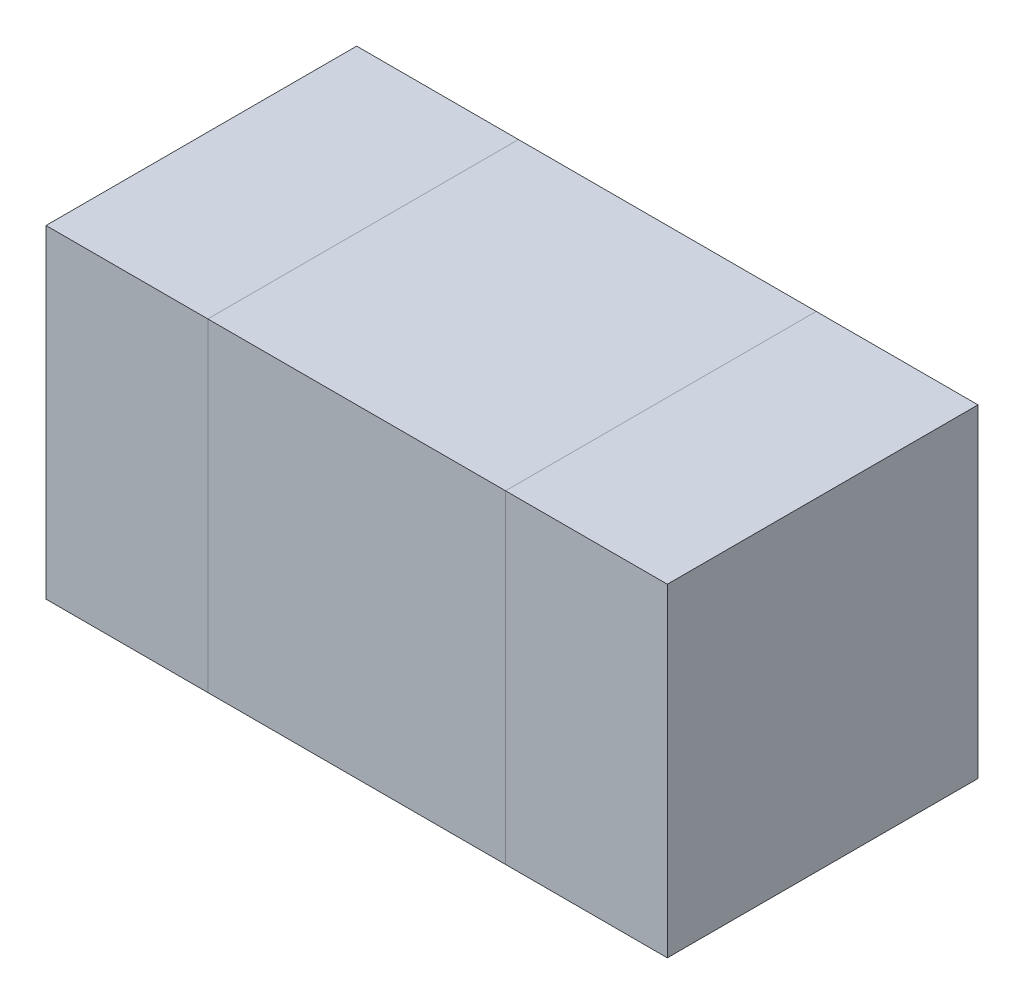
ISO-10303-21;
HEADER;
FILE_DESCRIPTION(('STEP AP214'),'2;1');
FILE_NAME('part.step','',(''),(''),'','','');
FILE_SCHEMA(('AUTOMOTIVE_DESIGN { 1 0 10303 214 1 1 1 1 }'));
ENDSEC;
DATA;
#1=APPLICATION_CONTEXT('core data for automotive mechanical design processes');
#2=APPLICATION_PROTOCOL_DEFINITION('international standard','automotive_design',2000,#1);
#3=PRODUCT_CONTEXT('',#1,'mechanical');
#4=PRODUCT('Part','Part','',(#3));
#5=PRODUCT_RELATED_PRODUCT_CATEGORY('part','',(#4));
#6=PRODUCT_DEFINITION_FORMATION('','',#4);
#7=PRODUCT_DEFINITION_CONTEXT('part definition',#1,'design');
#8=PRODUCT_DEFINITION('design','',#6,#7);
#9=PRODUCT_DEFINITION_SHAPE('','',#8);
#10=(LENGTH_UNIT() NAMED_UNIT(*) SI_UNIT(.MILLI.,.METRE.));
#11=(NAMED_UNIT(*) PLANE_ANGLE_UNIT() SI_UNIT($,.RADIAN.));
#12=(NAMED_UNIT(*) SI_UNIT($,.STERADIAN.) SOLID_ANGLE_UNIT());
#13=UNCERTAINTY_MEASURE_WITH_UNIT(LENGTH_MEASURE(1.E-05),#10,'distance_accuracy_value','');
#14=(GEOMETRIC_REPRESENTATION_CONTEXT(3) GLOBAL_UNCERTAINTY_ASSIGNED_CONTEXT((#13)) GLOBAL_UNIT_ASSIGNED_CONTEXT((#10,
#11,#12)) REPRESENTATION_CONTEXT('',''));
#15=CARTESIAN_POINT('',(0.,0.,0.));
#16=DIRECTION('',(0.,0.,1.));
#17=DIRECTION('',(1.,0.,0.));
#18=AXIS2_PLACEMENT_3D('',#15,#16,#17);
#19=CARTESIAN_POINT('',(0.23,0.,0.));
#20=DIRECTION('',(1.,0.,0.));
#21=DIRECTION('',(0.,1.,0.));
#22=AXIS2_PLACEMENT_3D('',#19,#20,#21);
#23=PLANE('',#22);
#24=DIRECTION('',(0.,-1.,0.));
#25=VECTOR('',#24,1.);
#26=CARTESIAN_POINT('',(0.23,0.25,0.48));
#27=LINE('',#26,#25);
#28=CARTESIAN_POINT('',(0.23,0.25,0.48));
#29=VERTEX_POINT('',#28);
#30=CARTESIAN_POINT('',(0.23,-0.25,0.48));
#31=VERTEX_POINT('',#30);
#32=EDGE_CURVE('P0_E94',#29,#31,#27,.T.);
#33=ORIENTED_EDGE('',*,*,#32,.T.);
#34=DIRECTION('',(0.,0.,-1.));
#35=VECTOR('',#34,1.);
#36=CARTESIAN_POINT('',(0.23,-0.25,0.48));
#37=LINE('',#36,#35);
#38=CARTESIAN_POINT('',(0.23,-0.25,0.));
#39=VERTEX_POINT('',#38);
#40=EDGE_CURVE('P0_E28',#31,#39,#37,.T.);
#41=ORIENTED_EDGE('',*,*,#40,.T.);
#42=DIRECTION('',(0.,1.,0.));
#43=VECTOR('',#42,1.);
#44=CARTESIAN_POINT('',(0.23,-0.25,0.));
#45=LINE('',#44,#43);
#46=CARTESIAN_POINT('',(0.23,0.25,0.));
#47=VERTEX_POINT('',#46);
#48=EDGE_CURVE('P0_E86',#39,#47,#45,.T.);
#49=ORIENTED_EDGE('',*,*,#48,.T.);
#50=DIRECTION('',(0.,0.,1.));
#51=VECTOR('',#50,1.);
#52=CARTESIAN_POINT('',(0.23,0.25,0.));
#53=LINE('',#52,#51);
#54=EDGE_CURVE('P0_E11',#47,#29,#53,.T.);
#55=ORIENTED_EDGE('',*,*,#54,.T.);
#56=EDGE_LOOP('',(#33,#41,#49,#55));
#57=FACE_BOUND('',#56,.T.);
#58=ADVANCED_FACE('P0_F17',(#57),#23,.T.);
#59=CARTESIAN_POINT('',(0.23,0.25,0.));
#60=DIRECTION('',(0.,-1.,0.));
#61=DIRECTION('',(0.,0.,-1.));
#62=AXIS2_PLACEMENT_3D('',#59,#60,#61);
#63=PLANE('',#62);
#64=DIRECTION('',(1.,0.,0.));
#65=VECTOR('',#64,1.);
#66=CARTESIAN_POINT('',(0.23,0.25,0.48));
#67=LINE('',#66,#65);
#68=CARTESIAN_POINT('',(-0.23,0.25,0.48));
#69=VERTEX_POINT('',#68);
#70=EDGE_CURVE('P0_E84',#69,#29,#67,.T.);
#71=ORIENTED_EDGE('',*,*,#70,.T.);
#72=ORIENTED_EDGE('',*,*,#54,.F.);
#73=DIRECTION('',(1.,0.,0.));
#74=VECTOR('',#73,1.);
#75=CARTESIAN_POINT('',(0.23,0.25,0.));
#76=LINE('',#75,#74);
#77=CARTESIAN_POINT('',(-0.23,0.25,0.));
#78=VERTEX_POINT('',#77);
#79=EDGE_CURVE('P0_E82',#78,#47,#76,.T.);
#80=ORIENTED_EDGE('',*,*,#79,.F.);
#81=DIRECTION('',(0.,0.,1.));
#82=VECTOR('',#81,1.);
#83=CARTESIAN_POINT('',(-0.23,0.25,0.));
#84=LINE('',#83,#82);
#85=EDGE_CURVE('P0_E56',#78,#69,#84,.T.);
#86=ORIENTED_EDGE('',*,*,#85,.T.);
#87=EDGE_LOOP('',(#71,#72,#80,#86));
#88=FACE_BOUND('',#87,.T.);
#89=ADVANCED_FACE('P0_F80',(#88),#63,.F.);
#90=CARTESIAN_POINT('',(0.23,-0.25,0.48));
#91=DIRECTION('',(0.,1.,0.));
#92=DIRECTION('',(1.,0.,0.));
#93=AXIS2_PLACEMENT_3D('',#90,#91,#92);
#94=PLANE('',#93);
#95=DIRECTION('',(1.,0.,0.));
#96=VECTOR('',#95,1.);
#97=CARTESIAN_POINT('',(0.23,-0.25,0.));
#98=LINE('',#97,#96);
#99=CARTESIAN_POINT('',(-0.23,-0.25,0.));
#100=VERTEX_POINT('',#99);
#101=EDGE_CURVE('P0_E90',#100,#39,#98,.T.);
#102=ORIENTED_EDGE('',*,*,#101,.T.);
#103=ORIENTED_EDGE('',*,*,#40,.F.);
#104=DIRECTION('',(1.,0.,0.));
#105=VECTOR('',#104,1.);
#106=CARTESIAN_POINT('',(0.23,-0.25,0.48));
#107=LINE('',#106,#105);
#108=CARTESIAN_POINT('',(-0.23,-0.25,0.48));
#109=VERTEX_POINT('',#108);
#110=EDGE_CURVE('P0_E100',#109,#31,#107,.T.);
#111=ORIENTED_EDGE('',*,*,#110,.F.);
#112=DIRECTION('',(0.,0.,-1.));
#113=VECTOR('',#112,1.);
#114=CARTESIAN_POINT('',(-0.23,-0.25,0.48));
#115=LINE('',#114,#113);
#116=EDGE_CURVE('P0_E41',#109,#100,#115,.T.);
#117=ORIENTED_EDGE('',*,*,#116,.T.);
#118=EDGE_LOOP('',(#102,#103,#111,#117));
#119=FACE_BOUND('',#118,.T.);
#120=ADVANCED_FACE('P0_F171',(#119),#94,.F.);
#121=CARTESIAN_POINT('',(-0.23,0.,0.));
#122=DIRECTION('',(1.,0.,0.));
#123=DIRECTION('',(0.,1.,0.));
#124=AXIS2_PLACEMENT_3D('',#121,#122,#123);
#125=PLANE('',#124);
#126=DIRECTION('',(0.,-1.,0.));
#127=VECTOR('',#126,1.);
#128=CARTESIAN_POINT('',(-0.23,0.25,0.48));
#129=LINE('',#128,#127);
#130=EDGE_CURVE('P0_E111',#69,#109,#129,.T.);
#131=ORIENTED_EDGE('',*,*,#130,.F.);
#132=ORIENTED_EDGE('',*,*,#85,.F.);
#133=DIRECTION('',(0.,1.,0.));
#134=VECTOR('',#133,1.);
#135=CARTESIAN_POINT('',(-0.23,-0.25,0.));
#136=LINE('',#135,#134);
#137=EDGE_CURVE('P0_E21',#100,#78,#136,.T.);
#138=ORIENTED_EDGE('',*,*,#137,.F.);
#139=ORIENTED_EDGE('',*,*,#116,.F.);
#140=EDGE_LOOP('',(#131,#132,#138,#139));
#141=FACE_BOUND('',#140,.T.);
#142=ADVANCED_FACE('P0_F19',(#141),#125,.F.);
#143=CARTESIAN_POINT('',(0.23,-0.25,0.));
#144=DIRECTION('',(0.,0.,1.));
#145=DIRECTION('',(1.,0.,0.));
#146=AXIS2_PLACEMENT_3D('',#143,#144,#145);
#147=PLANE('',#146);
#148=ORIENTED_EDGE('',*,*,#79,.T.);
#149=ORIENTED_EDGE('',*,*,#48,.F.);
#150=ORIENTED_EDGE('',*,*,#101,.F.);
#151=ORIENTED_EDGE('',*,*,#137,.T.);
#152=EDGE_LOOP('',(#148,#149,#150,#151));
#153=FACE_BOUND('',#152,.T.);
#154=ADVANCED_FACE('P0_F92',(#153),#147,.F.);
#155=CARTESIAN_POINT('',(0.23,0.25,0.48));
#156=DIRECTION('',(0.,0.,-1.));
#157=DIRECTION('',(0.,-1.,0.));
#158=AXIS2_PLACEMENT_3D('',#155,#156,#157);
#159=PLANE('',#158);
#160=ORIENTED_EDGE('',*,*,#70,.F.);
#161=ORIENTED_EDGE('',*,*,#130,.T.);
#162=ORIENTED_EDGE('',*,*,#110,.T.);
#163=ORIENTED_EDGE('',*,*,#32,.F.);
#164=EDGE_LOOP('',(#160,#161,#162,#163));
#165=FACE_BOUND('',#164,.T.);
#166=ADVANCED_FACE('P0_F158',(#165),#159,.F.);
#167=CLOSED_SHELL('',(#58,#89,#120,#142,#154,#166));
#168=MANIFOLD_SOLID_BREP('P0_B1',#167);
#169=CARTESIAN_POINT('',(-0.23,0.,0.));
#170=DIRECTION('',(1.,0.,0.));
#171=DIRECTION('',(0.,1.,0.));
#172=AXIS2_PLACEMENT_3D('',#169,#170,#171);
#173=PLANE('',#172);
#174=DIRECTION('',(0.,0.,1.));
#175=VECTOR('',#174,1.);
#176=CARTESIAN_POINT('',(-0.23,0.25,0.));
#177=LINE('',#176,#175);
#178=CARTESIAN_POINT('',(-0.23,0.25,0.));
#179=VERTEX_POINT('',#178);
#180=CARTESIAN_POINT('',(-0.23,0.25,0.48));
#181=VERTEX_POINT('',#180);
#182=EDGE_CURVE('P1_E89',#179,#181,#177,.T.);
#183=ORIENTED_EDGE('',*,*,#182,.T.);
#184=DIRECTION('',(0.,-1.,0.));
#185=VECTOR('',#184,1.);
#186=CARTESIAN_POINT('',(-0.23,0.25,0.48));
#187=LINE('',#186,#185);
#188=CARTESIAN_POINT('',(-0.23,-0.25,0.48));
#189=VERTEX_POINT('',#188);
#190=EDGE_CURVE('P1_E102',#181,#189,#187,.T.);
#191=ORIENTED_EDGE('',*,*,#190,.T.);
#192=DIRECTION('',(0.,0.,-1.));
#193=VECTOR('',#192,1.);
#194=CARTESIAN_POINT('',(-0.23,-0.25,0.48));
#195=LINE('',#194,#193);
#196=CARTESIAN_POINT('',(-0.23,-0.25,0.));
#197=VERTEX_POINT('',#196);
#198=EDGE_CURVE('P1_E27',#189,#197,#195,.T.);
#199=ORIENTED_EDGE('',*,*,#198,.T.);
#200=DIRECTION('',(0.,1.,0.));
#201=VECTOR('',#200,1.);
#202=CARTESIAN_POINT('',(-0.23,-0.25,0.));
#203=LINE('',#202,#201);
#204=EDGE_CURVE('P1_E98',#197,#179,#203,.T.);
#205=ORIENTED_EDGE('',*,*,#204,.T.);
#206=EDGE_LOOP('',(#183,#191,#199,#205));
#207=FACE_BOUND('',#206,.T.);
#208=ADVANCED_FACE('P1_F17',(#207),#173,.T.);
#209=CARTESIAN_POINT('',(-0.48,0.,0.));
#210=DIRECTION('',(1.,0.,0.));
#211=DIRECTION('',(0.,1.,0.));
#212=AXIS2_PLACEMENT_3D('',#209,#210,#211);
#213=PLANE('',#212);
#214=DIRECTION('',(0.,0.,-1.));
#215=VECTOR('',#214,1.);
#216=CARTESIAN_POINT('',(-0.48,0.25,0.));
#217=LINE('',#216,#215);
#218=CARTESIAN_POINT('',(-0.48,0.25,0.48));
#219=VERTEX_POINT('',#218);
#220=CARTESIAN_POINT('',(-0.48,0.25,0.));
#221=VERTEX_POINT('',#220);
#222=EDGE_CURVE('P1_E77',#219,#221,#217,.T.);
#223=ORIENTED_EDGE('',*,*,#222,.T.);
#224=DIRECTION('',(0.,-1.,0.));
#225=VECTOR('',#224,1.);
#226=CARTESIAN_POINT('',(-0.48,-0.125,0.));
#227=LINE('',#226,#225);
#228=CARTESIAN_POINT('',(-0.48,-0.25,0.));
#229=VERTEX_POINT('',#228);
#230=EDGE_CURVE('P1_E66',#221,#229,#227,.T.);
#231=ORIENTED_EDGE('',*,*,#230,.T.);
#232=DIRECTION('',(0.,0.,-1.));
#233=VECTOR('',#232,1.);
#234=CARTESIAN_POINT('',(-0.48,-0.25,0.24));
#235=LINE('',#234,#233);
#236=CARTESIAN_POINT('',(-0.48,-0.25,0.48));
#237=VERTEX_POINT('',#236);
#238=EDGE_CURVE('P1_E11',#237,#229,#235,.T.);
#239=ORIENTED_EDGE('',*,*,#238,.F.);
#240=DIRECTION('',(0.,-1.,0.));
#241=VECTOR('',#240,1.);
#242=CARTESIAN_POINT('',(-0.48,0.125,0.48));
#243=LINE('',#242,#241);
#244=EDGE_CURVE('P1_E75',#219,#237,#243,.T.);
#245=ORIENTED_EDGE('',*,*,#244,.F.);
#246=EDGE_LOOP('',(#223,#231,#239,#245));
#247=FACE_BOUND('',#246,.T.);
#248=ADVANCED_FACE('P1_F78',(#247),#213,.F.);
#249=CARTESIAN_POINT('',(-0.48,-0.25,0.48));
#250=DIRECTION('',(0.,-1.,0.));
#251=DIRECTION('',(0.,0.,-1.));
#252=AXIS2_PLACEMENT_3D('',#249,#250,#251);
#253=PLANE('',#252);
#254=DIRECTION('',(1.,0.,0.));
#255=VECTOR('',#254,1.);
#256=CARTESIAN_POINT('',(-0.48,-0.25,0.));
#257=LINE('',#256,#255);
#258=EDGE_CURVE('P1_E72',#229,#197,#257,.T.);
#259=ORIENTED_EDGE('',*,*,#258,.T.);
#260=ORIENTED_EDGE('',*,*,#198,.F.);
#261=DIRECTION('',(-1.,0.,0.));
#262=VECTOR('',#261,1.);
#263=CARTESIAN_POINT('',(-0.48,-0.25,0.48));
#264=LINE('',#263,#262);
#265=EDGE_CURVE('P1_E101',#189,#237,#264,.T.);
#266=ORIENTED_EDGE('',*,*,#265,.T.);
#267=ORIENTED_EDGE('',*,*,#238,.T.);
#268=EDGE_LOOP('',(#259,#260,#266,#267));
#269=FACE_BOUND('',#268,.T.);
#270=ADVANCED_FACE('P1_F119',(#269),#253,.T.);
#271=CARTESIAN_POINT('',(-0.48,0.25,0.48));
#272=DIRECTION('',(0.,0.,1.));
#273=DIRECTION('',(1.,0.,0.));
#274=AXIS2_PLACEMENT_3D('',#271,#272,#273);
#275=PLANE('',#274);
#276=DIRECTION('',(-1.,0.,0.));
#277=VECTOR('',#276,1.);
#278=CARTESIAN_POINT('',(-0.48,0.25,0.48));
#279=LINE('',#278,#277);
#280=EDGE_CURVE('P1_E84',#181,#219,#279,.T.);
#281=ORIENTED_EDGE('',*,*,#280,.T.);
#282=ORIENTED_EDGE('',*,*,#244,.T.);
#283=ORIENTED_EDGE('',*,*,#265,.F.);
#284=ORIENTED_EDGE('',*,*,#190,.F.);
#285=EDGE_LOOP('',(#281,#282,#283,#284));
#286=FACE_BOUND('',#285,.T.);
#287=ADVANCED_FACE('P1_F19',(#286),#275,.T.);
#288=CARTESIAN_POINT('',(-0.48,-0.25,0.));
#289=DIRECTION('',(0.,0.,-1.));
#290=DIRECTION('',(0.,-1.,0.));
#291=AXIS2_PLACEMENT_3D('',#288,#289,#290);
#292=PLANE('',#291);
#293=DIRECTION('',(1.,0.,0.));
#294=VECTOR('',#293,1.);
#295=CARTESIAN_POINT('',(-0.48,0.25,0.));
#296=LINE('',#295,#294);
#297=EDGE_CURVE('P1_E71',#221,#179,#296,.T.);
#298=ORIENTED_EDGE('',*,*,#297,.T.);
#299=ORIENTED_EDGE('',*,*,#204,.F.);
#300=ORIENTED_EDGE('',*,*,#258,.F.);
#301=ORIENTED_EDGE('',*,*,#230,.F.);
#302=EDGE_LOOP('',(#298,#299,#300,#301));
#303=FACE_BOUND('',#302,.T.);
#304=ADVANCED_FACE('P1_F68',(#303),#292,.T.);
#305=CARTESIAN_POINT('',(-0.48,0.25,0.));
#306=DIRECTION('',(0.,1.,0.));
#307=DIRECTION('',(1.,0.,0.));
#308=AXIS2_PLACEMENT_3D('',#305,#306,#307);
#309=PLANE('',#308);
#310=ORIENTED_EDGE('',*,*,#297,.F.);
#311=ORIENTED_EDGE('',*,*,#222,.F.);
#312=ORIENTED_EDGE('',*,*,#280,.F.);
#313=ORIENTED_EDGE('',*,*,#182,.F.);
#314=EDGE_LOOP('',(#310,#311,#312,#313));
#315=FACE_BOUND('',#314,.T.);
#316=ADVANCED_FACE('P1_F87',(#315),#309,.T.);
#317=CLOSED_SHELL('',(#208,#248,#270,#287,#304,#316));
#318=MANIFOLD_SOLID_BREP('P1_B1',#317);
#319=CARTESIAN_POINT('',(0.23,0.,0.));
#320=DIRECTION('',(1.,0.,0.));
#321=DIRECTION('',(0.,1.,0.));
#322=AXIS2_PLACEMENT_3D('',#319,#320,#321);
#323=PLANE('',#322);
#324=DIRECTION('',(0.,0.,1.));
#325=VECTOR('',#324,1.);
#326=CARTESIAN_POINT('',(0.23,0.25,0.));
#327=LINE('',#326,#325);
#328=CARTESIAN_POINT('',(0.23,0.25,0.));
#329=VERTEX_POINT('',#328);
#330=CARTESIAN_POINT('',(0.23,0.25,0.48));
#331=VERTEX_POINT('',#330);
#332=EDGE_CURVE('P2_E69',#329,#331,#327,.T.);
#333=ORIENTED_EDGE('',*,*,#332,.F.);
#334=DIRECTION('',(0.,1.,0.));
#335=VECTOR('',#334,1.);
#336=CARTESIAN_POINT('',(0.23,-0.25,0.));
#337=LINE('',#336,#335);
#338=CARTESIAN_POINT('',(0.23,-0.25,0.));
#339=VERTEX_POINT('',#338);
#340=EDGE_CURVE('P2_E21',#339,#329,#337,.T.);
#341=ORIENTED_EDGE('',*,*,#340,.F.);
#342=DIRECTION('',(0.,0.,-1.));
#343=VECTOR('',#342,1.);
#344=CARTESIAN_POINT('',(0.23,-0.25,0.48));
#345=LINE('',#344,#343);
#346=CARTESIAN_POINT('',(0.23,-0.25,0.48));
#347=VERTEX_POINT('',#346);
#348=EDGE_CURVE('P2_E11',#347,#339,#345,.T.);
#349=ORIENTED_EDGE('',*,*,#348,.F.);
#350=DIRECTION('',(0.,-1.,0.));
#351=VECTOR('',#350,1.);
#352=CARTESIAN_POINT('',(0.23,0.25,0.48));
#353=LINE('',#352,#351);
#354=EDGE_CURVE('P2_E65',#331,#347,#353,.T.);
#355=ORIENTED_EDGE('',*,*,#354,.F.);
#356=EDGE_LOOP('',(#333,#341,#349,#355));
#357=FACE_BOUND('',#356,.T.);
#358=ADVANCED_FACE('P2_F17',(#357),#323,.F.);
#359=CARTESIAN_POINT('',(0.48,0.,0.));
#360=DIRECTION('',(1.,0.,0.));
#361=DIRECTION('',(0.,1.,0.));
#362=AXIS2_PLACEMENT_3D('',#359,#360,#361);
#363=PLANE('',#362);
#364=DIRECTION('',(0.,0.,-1.));
#365=VECTOR('',#364,1.);
#366=CARTESIAN_POINT('',(0.48,0.25,0.));
#367=LINE('',#366,#365);
#368=CARTESIAN_POINT('',(0.48,0.25,0.48));
#369=VERTEX_POINT('',#368);
#370=CARTESIAN_POINT('',(0.48,0.25,0.));
#371=VERTEX_POINT('',#370);
#372=EDGE_CURVE('P2_E83',#369,#371,#367,.T.);
#373=ORIENTED_EDGE('',*,*,#372,.F.);
#374=DIRECTION('',(0.,-1.,0.));
#375=VECTOR('',#374,1.);
#376=CARTESIAN_POINT('',(0.48,0.125,0.48));
#377=LINE('',#376,#375);
#378=CARTESIAN_POINT('',(0.48,-0.25,0.48));
#379=VERTEX_POINT('',#378);
#380=EDGE_CURVE('P2_E78',#369,#379,#377,.T.);
#381=ORIENTED_EDGE('',*,*,#380,.T.);
#382=DIRECTION('',(0.,0.,-1.));
#383=VECTOR('',#382,1.);
#384=CARTESIAN_POINT('',(0.48,-0.25,0.24));
#385=LINE('',#384,#383);
#386=CARTESIAN_POINT('',(0.48,-0.25,0.));
#387=VERTEX_POINT('',#386);
#388=EDGE_CURVE('P2_E28',#379,#387,#385,.T.);
#389=ORIENTED_EDGE('',*,*,#388,.T.);
#390=DIRECTION('',(0.,-1.,0.));
#391=VECTOR('',#390,1.);
#392=CARTESIAN_POINT('',(0.48,-0.125,0.));
#393=LINE('',#392,#391);
#394=EDGE_CURVE('P2_E98',#371,#387,#393,.T.);
#395=ORIENTED_EDGE('',*,*,#394,.F.);
#396=EDGE_LOOP('',(#373,#381,#389,#395));
#397=FACE_BOUND('',#396,.T.);
#398=ADVANCED_FACE('P2_F123',(#397),#363,.T.);
#399=CARTESIAN_POINT('',(0.48,-0.25,0.48));
#400=DIRECTION('',(0.,1.,0.));
#401=DIRECTION('',(1.,0.,0.));
#402=AXIS2_PLACEMENT_3D('',#399,#400,#401);
#403=PLANE('',#402);
#404=DIRECTION('',(-1.,0.,0.));
#405=VECTOR('',#404,1.);
#406=CARTESIAN_POINT('',(0.48,-0.25,0.));
#407=LINE('',#406,#405);
#408=EDGE_CURVE('P2_E102',#387,#339,#407,.T.);
#409=ORIENTED_EDGE('',*,*,#408,.F.);
#410=ORIENTED_EDGE('',*,*,#388,.F.);
#411=DIRECTION('',(1.,0.,0.));
#412=VECTOR('',#411,1.);
#413=CARTESIAN_POINT('',(0.48,-0.25,0.48));
#414=LINE('',#413,#412);
#415=EDGE_CURVE('P2_E74',#347,#379,#414,.T.);
#416=ORIENTED_EDGE('',*,*,#415,.F.);
#417=ORIENTED_EDGE('',*,*,#348,.T.);
#418=EDGE_LOOP('',(#409,#410,#416,#417));
#419=FACE_BOUND('',#418,.T.);
#420=ADVANCED_FACE('P2_F124',(#419),#403,.F.);
#421=CARTESIAN_POINT('',(0.48,0.25,0.48));
#422=DIRECTION('',(0.,0.,-1.));
#423=DIRECTION('',(0.,-1.,0.));
#424=AXIS2_PLACEMENT_3D('',#421,#422,#423);
#425=PLANE('',#424);
#426=DIRECTION('',(1.,0.,0.));
#427=VECTOR('',#426,1.);
#428=CARTESIAN_POINT('',(0.48,0.25,0.48));
#429=LINE('',#428,#427);
#430=EDGE_CURVE('P2_E77',#331,#369,#429,.T.);
#431=ORIENTED_EDGE('',*,*,#430,.F.);
#432=ORIENTED_EDGE('',*,*,#354,.T.);
#433=ORIENTED_EDGE('',*,*,#415,.T.);
#434=ORIENTED_EDGE('',*,*,#380,.F.);
#435=EDGE_LOOP('',(#431,#432,#433,#434));
#436=FACE_BOUND('',#435,.T.);
#437=ADVANCED_FACE('P2_F19',(#436),#425,.F.);
#438=CARTESIAN_POINT('',(0.48,-0.25,0.));
#439=DIRECTION('',(0.,0.,1.));
#440=DIRECTION('',(1.,0.,0.));
#441=AXIS2_PLACEMENT_3D('',#438,#439,#440);
#442=PLANE('',#441);
#443=DIRECTION('',(-1.,0.,0.));
#444=VECTOR('',#443,1.);
#445=CARTESIAN_POINT('',(0.48,0.25,0.));
#446=LINE('',#445,#444);
#447=EDGE_CURVE('P2_E87',#371,#329,#446,.T.);
#448=ORIENTED_EDGE('',*,*,#447,.F.);
#449=ORIENTED_EDGE('',*,*,#394,.T.);
#450=ORIENTED_EDGE('',*,*,#408,.T.);
#451=ORIENTED_EDGE('',*,*,#340,.T.);
#452=EDGE_LOOP('',(#448,#449,#450,#451));
#453=FACE_BOUND('',#452,.T.);
#454=ADVANCED_FACE('P2_F117',(#453),#442,.F.);
#455=CARTESIAN_POINT('',(0.48,0.25,0.));
#456=DIRECTION('',(0.,-1.,0.));
#457=DIRECTION('',(0.,0.,-1.));
#458=AXIS2_PLACEMENT_3D('',#455,#456,#457);
#459=PLANE('',#458);
#460=ORIENTED_EDGE('',*,*,#447,.T.);
#461=ORIENTED_EDGE('',*,*,#332,.T.);
#462=ORIENTED_EDGE('',*,*,#430,.T.);
#463=ORIENTED_EDGE('',*,*,#372,.T.);
#464=EDGE_LOOP('',(#460,#461,#462,#463));
#465=FACE_BOUND('',#464,.T.);
#466=ADVANCED_FACE('P2_F85',(#465),#459,.F.);
#467=CLOSED_SHELL('',(#358,#398,#420,#437,#454,#466));
#468=MANIFOLD_SOLID_BREP('P2_B1',#467);
#469=ADVANCED_BREP_SHAPE_REPRESENTATION('',(#18,#168,#318,#468),#14);
#470=SHAPE_DEFINITION_REPRESENTATION(#9,#469);
ENDSEC;
END-ISO-10303-21;
